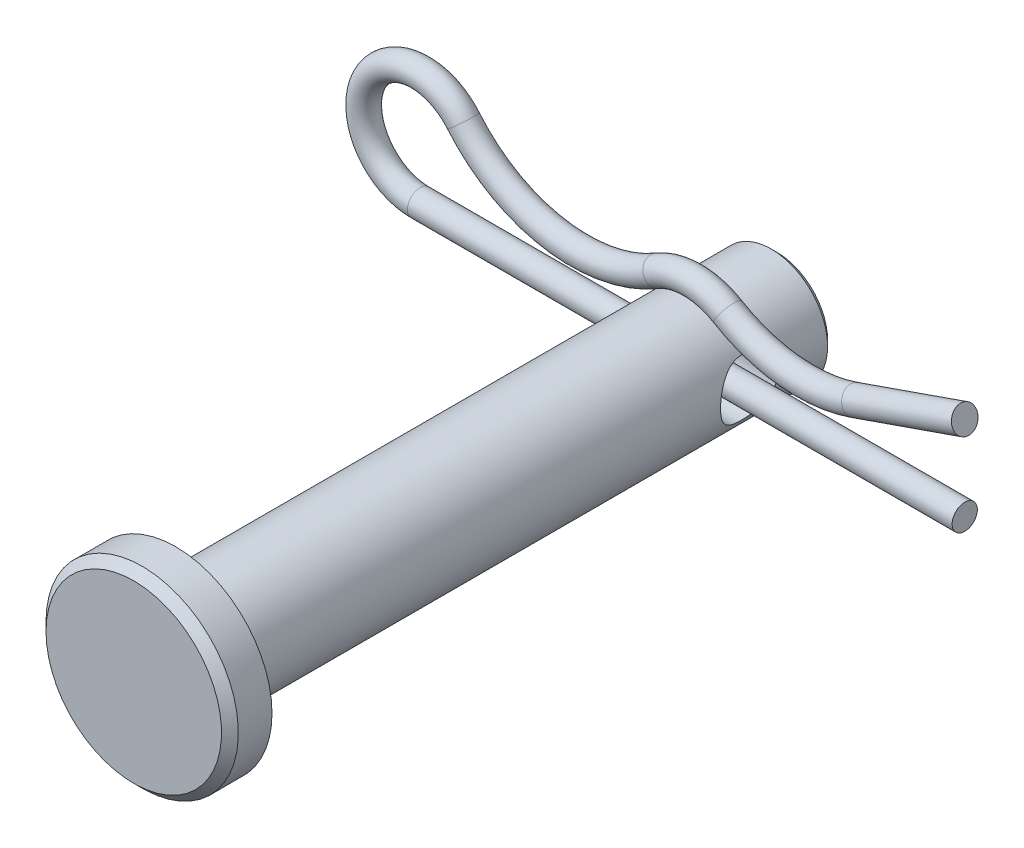
ISO-10303-21;
HEADER;
FILE_DESCRIPTION(('STEP AP214'),'2;1');
FILE_NAME('part.step','',(''),(''),'','','');
FILE_SCHEMA(('AUTOMOTIVE_DESIGN { 1 0 10303 214 1 1 1 1 }'));
ENDSEC;
DATA;
#1=APPLICATION_CONTEXT('core data for automotive mechanical design processes');
#2=APPLICATION_PROTOCOL_DEFINITION('international standard','automotive_design',2000,#1);
#3=PRODUCT_CONTEXT('',#1,'mechanical');
#4=PRODUCT('Part','Part','',(#3));
#5=PRODUCT_RELATED_PRODUCT_CATEGORY('part','',(#4));
#6=PRODUCT_DEFINITION_FORMATION('','',#4);
#7=PRODUCT_DEFINITION_CONTEXT('part definition',#1,'design');
#8=PRODUCT_DEFINITION('design','',#6,#7);
#9=PRODUCT_DEFINITION_SHAPE('','',#8);
#10=(LENGTH_UNIT() NAMED_UNIT(*) SI_UNIT(.MILLI.,.METRE.));
#11=(NAMED_UNIT(*) PLANE_ANGLE_UNIT() SI_UNIT($,.RADIAN.));
#12=(NAMED_UNIT(*) SI_UNIT($,.STERADIAN.) SOLID_ANGLE_UNIT());
#13=UNCERTAINTY_MEASURE_WITH_UNIT(LENGTH_MEASURE(1.E-05),#10,'distance_accuracy_value','');
#14=(GEOMETRIC_REPRESENTATION_CONTEXT(3) GLOBAL_UNCERTAINTY_ASSIGNED_CONTEXT((#13)) GLOBAL_UNIT_ASSIGNED_CONTEXT((#10,
#11,#12)) REPRESENTATION_CONTEXT('',''));
#15=CARTESIAN_POINT('',(0.,0.,0.));
#16=DIRECTION('',(0.,0.,1.));
#17=DIRECTION('',(1.,0.,0.));
#18=AXIS2_PLACEMENT_3D('',#15,#16,#17);
#19=CARTESIAN_POINT('',(6.8677417632059,1.95548396251024,-9.128125));
#20=DIRECTION('',(0.944376159944791,0.32886725061631,0.));
#21=DIRECTION('',(-0.32886725061631,0.944376159944791,0.));
#22=AXIS2_PLACEMENT_3D('',#19,#20,#21);
#23=CYLINDRICAL_SURFACE('',#22,0.533400000000001);
#24=CARTESIAN_POINT('',(6.8677417632059,1.95548396251024,-9.128125));
#25=DIRECTION('',(0.944376159944795,0.328867250616297,0.));
#26=DIRECTION('',(-0.328867250616297,0.944376159944795,0.));
#27=AXIS2_PLACEMENT_3D('',#24,#25,#26);
#28=CIRCLE('',#27,0.533400000000001);
#29=CARTESIAN_POINT('',(7.04315955468464,1.45175371879569,-9.128125));
#30=VERTEX_POINT('',#29);
#31=EDGE_CURVE('E47',#30,#30,#28,.T.);
#32=ORIENTED_EDGE('',*,*,#31,.T.);
#33=EDGE_LOOP('',(#32));
#34=FACE_BOUND('',#33,.T.);
#35=CARTESIAN_POINT('',(11.509375,3.57187500000001,-9.128125));
#36=DIRECTION('',(0.944376159944795,0.328867250616297,0.));
#37=DIRECTION('',(-0.328867250616297,0.944376159944795,0.));
#38=AXIS2_PLACEMENT_3D('',#35,#36,#37);
#39=CIRCLE('',#38,0.533400000000001);
#40=CARTESIAN_POINT('',(11.3339572085213,4.07560524371457,-9.128125));
#41=VERTEX_POINT('',#40);
#42=EDGE_CURVE('E11',#41,#41,#39,.T.);
#43=ORIENTED_EDGE('',*,*,#42,.F.);
#44=EDGE_LOOP('',(#43));
#45=FACE_BOUND('',#44,.T.);
#46=ADVANCED_FACE('F41',(#34,#45),#23,.T.);
#47=CARTESIAN_POINT('',(4.7671809277289,7.98746060907687,-9.128125));
#48=DIRECTION('',(0.,0.,1.));
#49=DIRECTION('',(1.,0.,0.));
#50=AXIS2_PLACEMENT_3D('',#47,#48,#49);
#51=TOROIDAL_SURFACE('',#50,6.38726060907687,0.533400000000001);
#52=CARTESIAN_POINT('',(1.49374300344779,2.50278174480932,-9.128125));
#53=DIRECTION('',(0.858690321242454,-0.5124948118806,0.));
#54=DIRECTION('',(0.5124948118806,0.858690321242454,0.));
#55=AXIS2_PLACEMENT_3D('',#52,#53,#54);
#56=CIRCLE('',#55,0.533400000000001);
#57=CARTESIAN_POINT('',(1.22037827079068,2.04475632745859,-9.128125));
#58=VERTEX_POINT('',#57);
#59=EDGE_CURVE('E51',#58,#58,#56,.T.);
#60=CARTESIAN_POINT('',(4.7671809277289,7.98746060907687,-9.128125));
#61=DIRECTION('',(0.,0.,1.));
#62=DIRECTION('',(1.,0.,0.));
#63=AXIS2_PLACEMENT_3D('',#60,#61,#62);
#64=CIRCLE('',#63,6.92066060907687);
#65=EDGE_CURVE('',#58,#30,#64,.T.);
#66=ORIENTED_EDGE('',*,*,#59,.T.);
#67=ORIENTED_EDGE('',*,*,#31,.F.);
#68=ORIENTED_EDGE('',*,*,#65,.T.);
#69=ORIENTED_EDGE('',*,*,#65,.F.);
#70=EDGE_LOOP('',(#66,#68,#67,#69));
#71=FACE_BOUND('',#70,.T.);
#72=ADVANCED_FACE('F88',(#71),#51,.T.);
#73=CARTESIAN_POINT('',(0.,0.,-9.128125));
#74=DIRECTION('',(0.,0.,-1.));
#75=DIRECTION('',(-1.,0.,0.));
#76=AXIS2_PLACEMENT_3D('',#73,#74,#75);
#77=TOROIDAL_SURFACE('',#76,2.91465,0.533400000000001);
#78=CARTESIAN_POINT('',(-1.49374300344773,2.50278174480936,-9.128125));
#79=DIRECTION('',(0.858690321242467,0.512494811880577,0.));
#80=DIRECTION('',(-0.512494811880577,0.858690321242467,0.));
#81=AXIS2_PLACEMENT_3D('',#78,#79,#80);
#82=CIRCLE('',#81,0.533400000000001);
#83=CARTESIAN_POINT('',(-1.22037827079062,2.04475632745863,-9.128125));
#84=VERTEX_POINT('',#83);
#85=EDGE_CURVE('E55',#84,#84,#82,.T.);
#86=ORIENTED_EDGE('',*,*,#85,.T.);
#87=EDGE_LOOP('',(#86));
#88=FACE_BOUND('',#87,.T.);
#89=ORIENTED_EDGE('',*,*,#59,.F.);
#90=EDGE_LOOP('',(#89));
#91=FACE_BOUND('',#90,.T.);
#92=ADVANCED_FACE('F92',(#88,#91),#77,.T.);
#93=CARTESIAN_POINT('',(-4.7671809277289,7.98746060907687,-9.128125));
#94=DIRECTION('',(0.,0.,1.));
#95=DIRECTION('',(1.,0.,0.));
#96=AXIS2_PLACEMENT_3D('',#93,#94,#95);
#97=TOROIDAL_SURFACE('',#96,6.38726060907687,0.533400000000001);
#98=CARTESIAN_POINT('',(-9.67840844816891,3.90371939167124,-9.128125));
#99=DIRECTION('',(0.639357224848815,-0.7689098380393,0.));
#100=DIRECTION('',(0.7689098380393,0.639357224848815,0.));
#101=AXIS2_PLACEMENT_3D('',#98,#99,#100);
#102=CIRCLE('',#101,0.533400000000001);
#103=CARTESIAN_POINT('',(-10.0885449557791,3.56268624793687,-9.128125));
#104=VERTEX_POINT('',#103);
#105=EDGE_CURVE('E60',#104,#104,#102,.T.);
#106=CARTESIAN_POINT('',(-4.7671809277289,7.98746060907687,-9.128125));
#107=DIRECTION('',(0.,0.,1.));
#108=DIRECTION('',(1.,0.,0.));
#109=AXIS2_PLACEMENT_3D('',#106,#107,#108);
#110=CIRCLE('',#109,6.92066060907687);
#111=EDGE_CURVE('',#104,#84,#110,.T.);
#112=ORIENTED_EDGE('',*,*,#105,.T.);
#113=ORIENTED_EDGE('',*,*,#85,.F.);
#114=ORIENTED_EDGE('',*,*,#111,.T.);
#115=ORIENTED_EDGE('',*,*,#111,.F.);
#116=EDGE_LOOP('',(#112,#114,#113,#115));
#117=FACE_BOUND('',#116,.T.);
#118=ADVANCED_FACE('F98',(#117),#97,.T.);
#119=CARTESIAN_POINT('',(-11.509375,2.38125,-9.128125));
#120=DIRECTION('',(0.,0.,-1.));
#121=DIRECTION('',(-1.,0.,0.));
#122=AXIS2_PLACEMENT_3D('',#119,#120,#121);
#123=TOROIDAL_SURFACE('',#122,2.38125,0.533400000000001);
#124=CARTESIAN_POINT('',(-11.509375,0.,-9.128125));
#125=DIRECTION('',(-1.,0.,0.));
#126=DIRECTION('',(0.,-1.,0.));
#127=AXIS2_PLACEMENT_3D('',#124,#125,#126);
#128=CIRCLE('',#127,0.533400000000001);
#129=CARTESIAN_POINT('',(-11.509375,-0.533400000000001,-9.128125));
#130=VERTEX_POINT('',#129);
#131=EDGE_CURVE('E63',#130,#130,#128,.T.);
#132=ORIENTED_EDGE('',*,*,#131,.T.);
#133=EDGE_LOOP('',(#132));
#134=FACE_BOUND('',#133,.T.);
#135=ORIENTED_EDGE('',*,*,#105,.F.);
#136=EDGE_LOOP('',(#135));
#137=FACE_BOUND('',#136,.T.);
#138=ADVANCED_FACE('F70',(#134,#137),#123,.T.);
#139=CARTESIAN_POINT('',(-11.509375,0.,-9.128125));
#140=DIRECTION('',(1.,0.,0.));
#141=DIRECTION('',(0.,0.,-1.));
#142=AXIS2_PLACEMENT_3D('',#139,#140,#141);
#143=CYLINDRICAL_SURFACE('',#142,0.533400000000001);
#144=ORIENTED_EDGE('',*,*,#131,.F.);
#145=EDGE_LOOP('',(#144));
#146=FACE_BOUND('',#145,.T.);
#147=CARTESIAN_POINT('',(11.509375,0.,-9.128125));
#148=DIRECTION('',(-1.,0.,0.));
#149=DIRECTION('',(0.,-1.,0.));
#150=AXIS2_PLACEMENT_3D('',#147,#148,#149);
#151=CIRCLE('',#150,0.533400000000001);
#152=CARTESIAN_POINT('',(11.509375,-0.533400000000001,-9.128125));
#153=VERTEX_POINT('',#152);
#154=EDGE_CURVE('E64',#153,#153,#151,.T.);
#155=ORIENTED_EDGE('',*,*,#154,.T.);
#156=EDGE_LOOP('',(#155));
#157=FACE_BOUND('',#156,.T.);
#158=ADVANCED_FACE('F73',(#146,#157),#143,.T.);
#159=CARTESIAN_POINT('',(11.509375,3.57187500000001,-9.128125));
#160=DIRECTION('',(0.944376159944795,0.328867250616297,0.));
#161=DIRECTION('',(-0.328867250616297,0.944376159944795,0.));
#162=AXIS2_PLACEMENT_3D('',#159,#160,#161);
#163=PLANE('',#162);
#164=ORIENTED_EDGE('',*,*,#42,.T.);
#165=EDGE_LOOP('',(#164));
#166=FACE_BOUND('',#165,.T.);
#167=ADVANCED_FACE('F76',(#166),#163,.T.);
#168=CARTESIAN_POINT('',(11.509375,0.,-9.128125));
#169=DIRECTION('',(-1.,0.,0.));
#170=DIRECTION('',(0.,-1.,0.));
#171=AXIS2_PLACEMENT_3D('',#168,#169,#170);
#172=PLANE('',#171);
#173=ORIENTED_EDGE('',*,*,#154,.F.);
#174=EDGE_LOOP('',(#173));
#175=FACE_BOUND('',#174,.T.);
#176=ADVANCED_FACE('F80',(#175),#172,.F.);
#177=CLOSED_SHELL('',(#46,#72,#92,#118,#138,#158,#167,#176));
#178=MANIFOLD_SOLID_BREP('B2',#177);
#179=CARTESIAN_POINT('',(0.,0.,12.7));
#180=DIRECTION('',(0.,0.,-1.));
#181=DIRECTION('',(-1.,0.,0.));
#182=AXIS2_PLACEMENT_3D('',#179,#180,#181);
#183=CYLINDRICAL_SURFACE('',#182,2.38125);
#184=CARTESIAN_POINT('',(0.,0.,-12.461875));
#185=DIRECTION('',(0.,0.,1.));
#186=DIRECTION('',(1.,0.,0.));
#187=AXIS2_PLACEMENT_3D('',#184,#185,#186);
#188=CIRCLE('',#187,2.38125);
#189=CARTESIAN_POINT('',(2.38125,0.,-12.461875));
#190=VERTEX_POINT('',#189);
#191=EDGE_CURVE('E164',#190,#190,#188,.T.);
#192=ORIENTED_EDGE('',*,*,#191,.T.);
#193=EDGE_LOOP('',(#192));
#194=FACE_BOUND('',#193,.T.);
#195=CARTESIAN_POINT('',(-2.38125,0.,-7.9375));
#196=CARTESIAN_POINT('',(-2.38124658771817,-0.0625934933908995,-7.93750393182415));
#197=CARTESIAN_POINT('',(-2.37875553370113,-0.12526160776547,-7.94246499331049));
#198=CARTESIAN_POINT('',(-2.36903604532025,-0.248745655116469,-7.9620898356559));
#199=CARTESIAN_POINT('',(-2.36179861446384,-0.309557840743265,-7.97677204291283));
#200=CARTESIAN_POINT('',(-2.34334382664568,-0.427355251873434,-8.01512137838437));
#201=CARTESIAN_POINT('',(-2.33214194770735,-0.484354349749462,-8.03875358874529));
#202=CARTESIAN_POINT('',(-2.30678565164099,-0.593493959385317,-8.09415127106263));
#203=CARTESIAN_POINT('',(-2.29263146732422,-0.645634853781903,-8.12591610174629));
#204=CARTESIAN_POINT('',(-2.26166669988499,-0.747126495522785,-8.19886272516843));
#205=CARTESIAN_POINT('',(-2.24474721461222,-0.796117610742265,-8.2404979643447));
#206=CARTESIAN_POINT('',(-2.2105140207503,-0.886753026544746,-8.3310271362285));
#207=CARTESIAN_POINT('',(-2.19320002298882,-0.928391728636494,-8.37992654851656));
#208=CARTESIAN_POINT('',(-2.15859063769341,-1.00637816303611,-8.48814423802628));
#209=CARTESIAN_POINT('',(-2.14140081986313,-1.04206516514117,-8.5479764170931));
#210=CARTESIAN_POINT('',(-2.11081118475794,-1.10271904514174,-8.67374360940859));
#211=CARTESIAN_POINT('',(-2.09740866244572,-1.12769358094429,-8.73967422201052));
#212=CARTESIAN_POINT('',(-2.07713897941891,-1.16458893898079,-8.87174189114298));
#213=CARTESIAN_POINT('',(-2.06992860854359,-1.1772017235864,-8.93763030074274));
#214=CARTESIAN_POINT('',(-2.06194687719966,-1.19113338890835,-9.07094980373119));
#215=CARTESIAN_POINT('',(-2.06116915374352,-1.19246343021919,-9.13837930647472));
#216=CARTESIAN_POINT('',(-2.06586451337536,-1.18429955128951,-9.26419679770049));
#217=CARTESIAN_POINT('',(-2.07060121735085,-1.17608099119853,-9.32270173717495));
#218=CARTESIAN_POINT('',(-2.0845013483624,-1.15126275778341,-9.43735639834728));
#219=CARTESIAN_POINT('',(-2.09366618546584,-1.13466041470314,-9.49350536362914));
#220=CARTESIAN_POINT('',(-2.1155915160392,-1.09324351977209,-9.60345718596099));
#221=CARTESIAN_POINT('',(-2.12843079040573,-1.06824668928498,-9.65717493105433));
#222=CARTESIAN_POINT('',(-2.15626240722546,-1.01089025937972,-9.75991145461498));
#223=CARTESIAN_POINT('',(-2.17125571566414,-0.97852735278922,-9.80892810832386));
#224=CARTESIAN_POINT('',(-2.204003536286,-0.90257239663054,-9.9074143665474));
#225=CARTESIAN_POINT('',(-2.22186710625626,-0.858076839495927,-9.95615334010161));
#226=CARTESIAN_POINT('',(-2.25680138992047,-0.761470860938948,-10.0457818577598));
#227=CARTESIAN_POINT('',(-2.27387172175947,-0.709356821108759,-10.0866676505153));
#228=CARTESIAN_POINT('',(-2.30626428608779,-0.595927464756045,-10.1612132401635));
#229=CARTESIAN_POINT('',(-2.3214685301789,-0.534297244998046,-10.1944493125057));
#230=CARTESIAN_POINT('',(-2.34741102209979,-0.405367587816348,-10.2498092752043));
#231=CARTESIAN_POINT('',(-2.35815281492167,-0.338072701740844,-10.2719419890337));
#232=CARTESIAN_POINT('',(-2.37320534860897,-0.205700104133523,-10.3026472775502));
#233=CARTESIAN_POINT('',(-2.37797504664999,-0.140900384809099,-10.312191127561));
#234=CARTESIAN_POINT('',(-2.38211931649743,-0.0104532111896992,-10.320493945507));
#235=CARTESIAN_POINT('',(-2.38149644415062,0.0551938267826013,-10.3192580225895));
#236=CARTESIAN_POINT('',(-2.37519200776753,0.180061757270823,-10.3065976616014));
#237=CARTESIAN_POINT('',(-2.36990626897501,0.239386357709477,-10.2959703282183));
#238=CARTESIAN_POINT('',(-2.35532022721706,0.35529070614697,-10.2660790456499));
#239=CARTESIAN_POINT('',(-2.34601948166815,0.411870150775843,-10.2468141443165));
#240=CARTESIAN_POINT('',(-2.323912493394,0.522551749435383,-10.199689325903));
#241=CARTESIAN_POINT('',(-2.31101362357334,0.576536816435452,-10.1715994059547));
#242=CARTESIAN_POINT('',(-2.28295169421308,0.679205558772778,-10.1078813403714));
#243=CARTESIAN_POINT('',(-2.26778767095513,0.727886962326195,-10.0722499834997));
#244=CARTESIAN_POINT('',(-2.23490101029919,0.823635905061684,-9.99042274358805));
#245=CARTESIAN_POINT('',(-2.21707334772675,0.870075505159961,-9.94353302224748));
#246=CARTESIAN_POINT('',(-2.18196785003363,0.954710182325452,-9.84258911676999));
#247=CARTESIAN_POINT('',(-2.1646904022613,0.992899556088159,-9.78853001790926));
#248=CARTESIAN_POINT('',(-2.13182825744162,1.06168973569882,-9.67147427421776));
#249=CARTESIAN_POINT('',(-2.11636605630571,1.0918334810305,-9.60817158617039));
#250=CARTESIAN_POINT('',(-2.090428799133,1.14071736472268,-9.47637082565359));
#251=CARTESIAN_POINT('',(-2.07994732092736,1.15947219672864,-9.40787957625952));
#252=CARTESIAN_POINT('',(-2.06646662138444,1.18331657161977,-9.27467876590559));
#253=CARTESIAN_POINT('',(-2.06284572182647,1.18954509883978,-9.21023734201106));
#254=CARTESIAN_POINT('',(-2.06175000375602,1.19144552443463,-9.08115833564985));
#255=CARTESIAN_POINT('',(-2.06427252119055,1.18712199863718,-9.01652085034461));
#256=CARTESIAN_POINT('',(-2.07451954503311,1.16910579328329,-8.89537745598845));
#257=CARTESIAN_POINT('',(-2.081725593681,1.1563448992644,-8.83868350273432));
#258=CARTESIAN_POINT('',(-2.09991741148739,1.12296816088622,-8.72830345780996));
#259=CARTESIAN_POINT('',(-2.11090439637645,1.10234978978715,-8.67461834007175));
#260=CARTESIAN_POINT('',(-2.13632093965266,1.05229312174863,-8.56778728679407));
#261=CARTESIAN_POINT('',(-2.15093219477964,1.02235532346272,-8.51491990438401));
#262=CARTESIAN_POINT('',(-2.18164566727434,0.955061000604868,-8.41461375535999));
#263=CARTESIAN_POINT('',(-2.19774865799103,0.917700616381016,-8.36717783335142));
#264=CARTESIAN_POINT('',(-2.23197328511557,0.831298335810089,-8.27308720225546));
#265=CARTESIAN_POINT('',(-2.25010245755217,0.781388641146486,-8.22722775625034));
#266=CARTESIAN_POINT('',(-2.28454448778714,0.674078066156022,-8.14435563536124));
#267=CARTESIAN_POINT('',(-2.30085636405197,0.616673173627612,-8.10734772899557));
#268=CARTESIAN_POINT('',(-2.33002942662263,0.49521855746375,-8.04318420558625));
#269=CARTESIAN_POINT('',(-2.34286539970213,0.431124721872151,-8.01610009829451));
#270=CARTESIAN_POINT('',(-2.36340659560876,0.298539814353397,-7.9734471500715));
#271=CARTESIAN_POINT('',(-2.37112639390897,0.230061848926332,-7.95784558236853));
#272=CARTESIAN_POINT('',(-2.37762409336193,0.134066692531779,-7.94476589493782));
#273=CARTESIAN_POINT('',(-2.37898025606987,0.107348987707653,-7.94204504322175));
#274=CARTESIAN_POINT('',(-2.3807939546427,0.0537587806828973,-7.93841122636905));
#275=CARTESIAN_POINT('',(-2.38125146570418,0.0268862742301636,-7.93749831113273));
#276=CARTESIAN_POINT('',(-2.38125,0.,-7.9375));
#277=B_SPLINE_CURVE_WITH_KNOTS('',3,(#195,#196,#197,#198,#199,#200,#201,#202,#203,#204,#205,
#206,#207,#208,#209,#210,#211,#212,#213,#214,#215,#216,#217,#218,#219,#220,#221,#222,#223,#224,
#225,#226,#227,#228,#229,#230,#231,#232,#233,#234,#235,#236,#237,#238,#239,#240,#241,#242,#243,
#244,#245,#246,#247,#248,#249,#250,#251,#252,#253,#254,#255,#256,#257,#258,#259,#260,#261,#262,
#263,#264,#265,#266,#267,#268,#269,#270,#271,#272,#273,#274,#275,#276),.UNSPECIFIED.,.T.,.F.,(4,
2,2,2,2,2,2,2,2,2,2,2,2,2,2,2,2,2,2,2,2,2,2,2,2,2,2,2,2,2,2,2,2,2,2,2,2,2,2,2,4),(0.,
0.187671381491036,0.375699515747514,0.563001503883018,0.750288727442429,0.948906406473725,
1.14767467670684,1.36185743031615,1.57588681716391,1.77710320704461,1.97812053569865,
2.15509926337347,2.33213438424011,2.51329317200605,2.69453345625452,2.89875445775649,
3.10307277131561,3.31687910824069,3.53051527011183,3.72645730217446,3.92230647121476,
4.10297598058852,4.28366541066828,4.46952119208217,4.65545627297242,4.85965036423511,
5.06398516445249,5.27821543446362,5.49216872029489,5.68558331740251,5.87891405645819,
6.0538272319698,6.22879670208067,6.41552156348466,6.60234377481072,6.81186617152194,
7.02150118957732,7.23261841267421,7.44313156831558,7.52374130413947,7.6043532648174),.UNSPECIFIED.);
#278=CARTESIAN_POINT('',(-2.38125,0.,-7.9375));
#279=VERTEX_POINT('',#278);
#280=EDGE_CURVE('E175',#279,#279,#277,.T.);
#281=ORIENTED_EDGE('',*,*,#280,.T.);
#282=EDGE_LOOP('',(#281));
#283=FACE_BOUND('',#282,.T.);
#284=CARTESIAN_POINT('',(2.38125,0.,-10.31875));
#285=CARTESIAN_POINT('',(2.38124658771817,-0.0625934933908995,-10.3187460681758));
#286=CARTESIAN_POINT('',(2.37875553370113,-0.12526160776547,-10.3137850066895));
#287=CARTESIAN_POINT('',(2.36903604532025,-0.248745655116469,-10.2941601643441));
#288=CARTESIAN_POINT('',(2.36179861446384,-0.309557840743266,-10.2794779570872));
#289=CARTESIAN_POINT('',(2.34334382664568,-0.427355251873434,-10.2411286216156));
#290=CARTESIAN_POINT('',(2.33214194770735,-0.48435434974946,-10.2174964112547));
#291=CARTESIAN_POINT('',(2.30678565164099,-0.593493959385315,-10.1620987289374));
#292=CARTESIAN_POINT('',(2.29263146732422,-0.645634853781903,-10.1303338982537));
#293=CARTESIAN_POINT('',(2.26166669988499,-0.747126495522785,-10.0573872748316));
#294=CARTESIAN_POINT('',(2.24474721461222,-0.796117610742265,-10.0157520356553));
#295=CARTESIAN_POINT('',(2.2105140207503,-0.886753026544746,-9.9252228637715));
#296=CARTESIAN_POINT('',(2.19320002298882,-0.928391728636495,-9.87632345148344));
#297=CARTESIAN_POINT('',(2.15859063769341,-1.00637816303611,-9.76810576197373));
#298=CARTESIAN_POINT('',(2.14140081986313,-1.04206516514117,-9.7082735829069));
#299=CARTESIAN_POINT('',(2.11081118475794,-1.10271904514174,-9.58250639059141));
#300=CARTESIAN_POINT('',(2.09740866244572,-1.12769358094429,-9.51657577798948));
#301=CARTESIAN_POINT('',(2.07713897941891,-1.16458893898079,-9.38450810885702));
#302=CARTESIAN_POINT('',(2.06992860854359,-1.1772017235864,-9.31861969925726));
#303=CARTESIAN_POINT('',(2.06194687719966,-1.19113338890835,-9.18530019626881));
#304=CARTESIAN_POINT('',(2.06116915374352,-1.19246343021919,-9.11787069352528));
#305=CARTESIAN_POINT('',(2.06586451337536,-1.18429955128951,-8.99205320229952));
#306=CARTESIAN_POINT('',(2.07060121735085,-1.17608099119853,-8.93354826282506));
#307=CARTESIAN_POINT('',(2.0845013483624,-1.15126275778341,-8.81889360165272));
#308=CARTESIAN_POINT('',(2.09366618546584,-1.13466041470314,-8.76274463637086));
#309=CARTESIAN_POINT('',(2.1155915160392,-1.09324351977209,-8.65279281403901));
#310=CARTESIAN_POINT('',(2.12843079040573,-1.06824668928498,-8.59907506894567));
#311=CARTESIAN_POINT('',(2.15626240722546,-1.01089025937972,-8.49633854538502));
#312=CARTESIAN_POINT('',(2.17125571566414,-0.97852735278922,-8.44732189167615));
#313=CARTESIAN_POINT('',(2.204003536286,-0.90257239663054,-8.3488356334526));
#314=CARTESIAN_POINT('',(2.22186710625626,-0.858076839495927,-8.30009665989839));
#315=CARTESIAN_POINT('',(2.25680138992047,-0.761470860938948,-8.21046814224021));
#316=CARTESIAN_POINT('',(2.27387172175947,-0.709356821108759,-8.16958234948466));
#317=CARTESIAN_POINT('',(2.30626428608779,-0.595927464756045,-8.09503675983648));
#318=CARTESIAN_POINT('',(2.3214685301789,-0.534297244998046,-8.06180068749429));
#319=CARTESIAN_POINT('',(2.34741102209979,-0.405367587816348,-8.00644072479567));
#320=CARTESIAN_POINT('',(2.35815281492167,-0.338072701740844,-7.98430801096632));
#321=CARTESIAN_POINT('',(2.37320534860897,-0.205700104133523,-7.95360272244983));
#322=CARTESIAN_POINT('',(2.37797504664999,-0.140900384809099,-7.94405887243899));
#323=CARTESIAN_POINT('',(2.38211931649743,-0.0104532111896992,-7.935756054493));
#324=CARTESIAN_POINT('',(2.38149644415062,0.0551938267826014,-7.9369919774105));
#325=CARTESIAN_POINT('',(2.37519200776753,0.180061757270823,-7.94965233839858));
#326=CARTESIAN_POINT('',(2.36990626897501,0.239386357709477,-7.96027967178169));
#327=CARTESIAN_POINT('',(2.35532022721706,0.35529070614697,-7.99017095435009));
#328=CARTESIAN_POINT('',(2.34601948166815,0.411870150775843,-8.00943585568353));
#329=CARTESIAN_POINT('',(2.323912493394,0.522551749435382,-8.05656067409699));
#330=CARTESIAN_POINT('',(2.31101362357334,0.576536816435451,-8.08465059404533));
#331=CARTESIAN_POINT('',(2.28295169421308,0.679205558772777,-8.14836865962857));
#332=CARTESIAN_POINT('',(2.26778767095513,0.727886962326195,-8.1840000165003));
#333=CARTESIAN_POINT('',(2.23490101029919,0.823635905061684,-8.26582725641195));
#334=CARTESIAN_POINT('',(2.21707334772675,0.870075505159961,-8.31271697775253));
#335=CARTESIAN_POINT('',(2.18196785003363,0.954710182325452,-8.41366088323002));
#336=CARTESIAN_POINT('',(2.1646904022613,0.992899556088159,-8.46771998209075));
#337=CARTESIAN_POINT('',(2.13182825744162,1.06168973569882,-8.58477572578225));
#338=CARTESIAN_POINT('',(2.11636605630571,1.0918334810305,-8.64807841382961));
#339=CARTESIAN_POINT('',(2.090428799133,1.14071736472268,-8.77987917434641));
#340=CARTESIAN_POINT('',(2.07994732092736,1.15947219672864,-8.84837042374048));
#341=CARTESIAN_POINT('',(2.06646662138444,1.18331657161977,-8.98157123409441));
#342=CARTESIAN_POINT('',(2.06284572182647,1.18954509883978,-9.04601265798895));
#343=CARTESIAN_POINT('',(2.06175000375602,1.19144552443463,-9.17509166435015));
#344=CARTESIAN_POINT('',(2.06427252119055,1.18712199863718,-9.23972914965539));
#345=CARTESIAN_POINT('',(2.07451954503311,1.16910579328329,-9.36087254401156));
#346=CARTESIAN_POINT('',(2.081725593681,1.1563448992644,-9.41756649726568));
#347=CARTESIAN_POINT('',(2.09991741148739,1.12296816088622,-9.52794654219004));
#348=CARTESIAN_POINT('',(2.11090439637645,1.10234978978715,-9.58163165992825));
#349=CARTESIAN_POINT('',(2.13632093965266,1.05229312174863,-9.68846271320593));
#350=CARTESIAN_POINT('',(2.15093219477964,1.02235532346272,-9.74133009561599));
#351=CARTESIAN_POINT('',(2.18164566727434,0.955061000604869,-9.84163624464001));
#352=CARTESIAN_POINT('',(2.19774865799103,0.917700616381016,-9.88907216664858));
#353=CARTESIAN_POINT('',(2.23197328511557,0.831298335810089,-9.98316279774454));
#354=CARTESIAN_POINT('',(2.25010245755217,0.781388641146486,-10.0290222437497));
#355=CARTESIAN_POINT('',(2.28454448778714,0.674078066156021,-10.1118943646388));
#356=CARTESIAN_POINT('',(2.30085636405197,0.616673173627611,-10.1489022710044));
#357=CARTESIAN_POINT('',(2.33002942662263,0.49521855746375,-10.2130657944138));
#358=CARTESIAN_POINT('',(2.34286539970213,0.431124721872151,-10.2401499017055));
#359=CARTESIAN_POINT('',(2.36340659560876,0.298539814353397,-10.2828028499285));
#360=CARTESIAN_POINT('',(2.37112639390897,0.230061848926332,-10.2984044176315));
#361=CARTESIAN_POINT('',(2.37762409336193,0.134066692531779,-10.3114841050622));
#362=CARTESIAN_POINT('',(2.37898025606987,0.107348987707653,-10.3142049567782));
#363=CARTESIAN_POINT('',(2.3807939546427,0.0537587806828973,-10.3178387736309));
#364=CARTESIAN_POINT('',(2.38125146570418,0.0268862742301636,-10.3187516888673));
#365=CARTESIAN_POINT('',(2.38125,0.,-10.31875));
#366=B_SPLINE_CURVE_WITH_KNOTS('',3,(#284,#285,#286,#287,#288,#289,#290,#291,#292,#293,#294,
#295,#296,#297,#298,#299,#300,#301,#302,#303,#304,#305,#306,#307,#308,#309,#310,#311,#312,#313,
#314,#315,#316,#317,#318,#319,#320,#321,#322,#323,#324,#325,#326,#327,#328,#329,#330,#331,#332,
#333,#334,#335,#336,#337,#338,#339,#340,#341,#342,#343,#344,#345,#346,#347,#348,#349,#350,#351,
#352,#353,#354,#355,#356,#357,#358,#359,#360,#361,#362,#363,#364,#365),.UNSPECIFIED.,.T.,.F.,(4,
2,2,2,2,2,2,2,2,2,2,2,2,2,2,2,2,2,2,2,2,2,2,2,2,2,2,2,2,2,2,2,2,2,2,2,2,2,2,2,4),(0.,
0.187671381491036,0.375699515747514,0.563001503883016,0.750288727442429,0.948906406473725,
1.14767467670684,1.36185743031615,1.57588681716391,1.77710320704461,1.97812053569865,
2.15509926337347,2.33213438424011,2.51329317200605,2.69453345625452,2.89875445775649,
3.10307277131561,3.31687910824069,3.53051527011183,3.72645730217446,3.92230647121476,
4.10297598058852,4.28366541066828,4.46952119208217,4.65545627297242,4.85965036423511,
5.06398516445249,5.27821543446362,5.49216872029489,5.68558331740251,5.87891405645819,
6.0538272319698,6.22879670208067,6.41552156348466,6.60234377481072,6.81186617152194,
7.02150118957732,7.23261841267421,7.44313156831558,7.52374130413947,7.6043532648174),.UNSPECIFIED.);
#367=CARTESIAN_POINT('',(2.38125,0.,-10.31875));
#368=VERTEX_POINT('',#367);
#369=EDGE_CURVE('E184',#368,#368,#366,.T.);
#370=ORIENTED_EDGE('',*,*,#369,.T.);
#371=EDGE_LOOP('',(#370));
#372=FACE_BOUND('',#371,.T.);
#373=CARTESIAN_POINT('',(0.,0.,12.7));
#374=DIRECTION('',(0.,0.,1.));
#375=DIRECTION('',(1.,0.,0.));
#376=AXIS2_PLACEMENT_3D('',#373,#374,#375);
#377=CIRCLE('',#376,2.38125);
#378=CARTESIAN_POINT('',(2.38125,0.,12.7));
#379=VERTEX_POINT('',#378);
#380=EDGE_CURVE('E223',#379,#379,#377,.T.);
#381=ORIENTED_EDGE('',*,*,#380,.F.);
#382=EDGE_LOOP('',(#381));
#383=FACE_BOUND('',#382,.T.);
#384=ADVANCED_FACE('F157',(#194,#283,#372,#383),#183,.T.);
#385=CARTESIAN_POINT('',(0.,0.,-12.7));
#386=DIRECTION('',(0.,0.,1.));
#387=DIRECTION('',(1.,0.,0.));
#388=AXIS2_PLACEMENT_3D('',#385,#386,#387);
#389=PLANE('',#388);
#390=CARTESIAN_POINT('',(0.,0.,-12.7));
#391=DIRECTION('',(0.,0.,1.));
#392=DIRECTION('',(1.,0.,0.));
#393=AXIS2_PLACEMENT_3D('',#390,#391,#392);
#394=CIRCLE('',#393,2.14312500000001);
#395=CARTESIAN_POINT('',(2.14312500000001,0.,-12.7));
#396=VERTEX_POINT('',#395);
#397=EDGE_CURVE('E40',#396,#396,#394,.F.);
#398=ORIENTED_EDGE('',*,*,#397,.T.);
#399=EDGE_LOOP('',(#398));
#400=FACE_BOUND('',#399,.T.);
#401=ADVANCED_FACE('F205',(#400),#389,.F.);
#402=CARTESIAN_POINT('',(0.,0.,12.7));
#403=DIRECTION('',(0.,0.,1.));
#404=DIRECTION('',(1.,0.,0.));
#405=AXIS2_PLACEMENT_3D('',#402,#403,#404);
#406=PLANE('',#405);
#407=CARTESIAN_POINT('',(0.,0.,12.7));
#408=DIRECTION('',(0.,0.,1.));
#409=DIRECTION('',(1.,0.,0.));
#410=AXIS2_PLACEMENT_3D('',#407,#408,#409);
#411=CIRCLE('',#410,4.064);
#412=CARTESIAN_POINT('',(4.064,0.,12.7));
#413=VERTEX_POINT('',#412);
#414=EDGE_CURVE('E183',#413,#413,#411,.T.);
#415=ORIENTED_EDGE('',*,*,#414,.F.);
#416=EDGE_LOOP('',(#415));
#417=FACE_BOUND('',#416,.T.);
#418=ORIENTED_EDGE('',*,*,#380,.T.);
#419=EDGE_LOOP('',(#418));
#420=FACE_BOUND('',#419,.T.);
#421=ADVANCED_FACE('F202',(#417,#420),#406,.F.);
#422=CARTESIAN_POINT('',(0.,0.,14.478));
#423=DIRECTION('',(0.,0.,-1.));
#424=DIRECTION('',(-1.,0.,0.));
#425=AXIS2_PLACEMENT_3D('',#422,#423,#424);
#426=CYLINDRICAL_SURFACE('',#425,4.064);
#427=CARTESIAN_POINT('',(0.,0.,14.1224));
#428=DIRECTION('',(0.,0.,1.));
#429=DIRECTION('',(1.,0.,0.));
#430=AXIS2_PLACEMENT_3D('',#427,#428,#429);
#431=CIRCLE('',#430,4.064);
#432=CARTESIAN_POINT('',(-4.064,0.,14.1224));
#433=VERTEX_POINT('',#432);
#434=EDGE_CURVE('E168',#433,#433,#431,.F.);
#435=ORIENTED_EDGE('',*,*,#434,.T.);
#436=EDGE_LOOP('',(#435));
#437=FACE_BOUND('',#436,.T.);
#438=ORIENTED_EDGE('',*,*,#414,.T.);
#439=EDGE_LOOP('',(#438));
#440=FACE_BOUND('',#439,.T.);
#441=ADVANCED_FACE('F200',(#437,#440),#426,.T.);
#442=CARTESIAN_POINT('',(0.,0.,14.478));
#443=DIRECTION('',(0.,0.,1.));
#444=DIRECTION('',(1.,0.,0.));
#445=AXIS2_PLACEMENT_3D('',#442,#443,#444);
#446=PLANE('',#445);
#447=CARTESIAN_POINT('',(0.,0.,14.478));
#448=DIRECTION('',(0.,0.,1.));
#449=DIRECTION('',(1.,0.,0.));
#450=AXIS2_PLACEMENT_3D('',#447,#448,#449);
#451=CIRCLE('',#450,3.7084);
#452=CARTESIAN_POINT('',(-3.7084,0.,14.478));
#453=VERTEX_POINT('',#452);
#454=EDGE_CURVE('E172',#453,#453,#451,.T.);
#455=ORIENTED_EDGE('',*,*,#454,.T.);
#456=EDGE_LOOP('',(#455));
#457=FACE_BOUND('',#456,.T.);
#458=ADVANCED_FACE('F196',(#457),#446,.T.);
#459=CARTESIAN_POINT('',(0.,0.,14.478));
#460=DIRECTION('',(0.,0.,-1.));
#461=DIRECTION('',(-1.,0.,0.));
#462=AXIS2_PLACEMENT_3D('',#459,#460,#461);
#463=CONICAL_SURFACE('',#462,3.7084,0.785398163397446);
#464=CARTESIAN_POINT('',(-4.064,0.,14.1224));
#465=CARTESIAN_POINT('',(-4.06029583333333,0.,14.1261041666667));
#466=CARTESIAN_POINT('',(-4.05659166666667,0.,14.1298083333333));
#467=CARTESIAN_POINT('',(-4.04918333333333,0.,14.1372166666667));
#468=CARTESIAN_POINT('',(-4.04547916666667,0.,14.1409208333333));
#469=CARTESIAN_POINT('',(-4.03807083333333,0.,14.1483291666667));
#470=CARTESIAN_POINT('',(-4.03436666666667,0.,14.1520333333333));
#471=CARTESIAN_POINT('',(-4.02695833333333,0.,14.1594416666667));
#472=CARTESIAN_POINT('',(-4.02325416666667,0.,14.1631458333333));
#473=CARTESIAN_POINT('',(-4.01584583333333,0.,14.1705541666667));
#474=CARTESIAN_POINT('',(-4.01214166666667,0.,14.1742583333333));
#475=CARTESIAN_POINT('',(-4.00473333333333,0.,14.1816666666667));
#476=CARTESIAN_POINT('',(-4.00102916666667,0.,14.1853708333333));
#477=CARTESIAN_POINT('',(-3.99362083333333,0.,14.1927791666667));
#478=CARTESIAN_POINT('',(-3.98991666666667,0.,14.1964833333333));
#479=CARTESIAN_POINT('',(-3.98250833333333,0.,14.2038916666667));
#480=CARTESIAN_POINT('',(-3.97880416666667,0.,14.2075958333333));
#481=CARTESIAN_POINT('',(-3.97139583333333,0.,14.2150041666667));
#482=CARTESIAN_POINT('',(-3.96769166666667,0.,14.2187083333333));
#483=CARTESIAN_POINT('',(-3.96028333333333,0.,14.2261166666667));
#484=CARTESIAN_POINT('',(-3.95657916666667,0.,14.2298208333333));
#485=CARTESIAN_POINT('',(-3.94917083333333,0.,14.2372291666667));
#486=CARTESIAN_POINT('',(-3.94546666666667,0.,14.2409333333333));
#487=CARTESIAN_POINT('',(-3.93805833333333,0.,14.2483416666667));
#488=CARTESIAN_POINT('',(-3.93435416666667,0.,14.2520458333333));
#489=CARTESIAN_POINT('',(-3.92694583333333,0.,14.2594541666667));
#490=CARTESIAN_POINT('',(-3.92324166666667,0.,14.2631583333333));
#491=CARTESIAN_POINT('',(-3.91583333333333,0.,14.2705666666667));
#492=CARTESIAN_POINT('',(-3.91212916666667,0.,14.2742708333333));
#493=CARTESIAN_POINT('',(-3.90472083333333,0.,14.2816791666667));
#494=CARTESIAN_POINT('',(-3.90101666666667,0.,14.2853833333333));
#495=CARTESIAN_POINT('',(-3.89360833333333,0.,14.2927916666667));
#496=CARTESIAN_POINT('',(-3.88990416666667,0.,14.2964958333333));
#497=CARTESIAN_POINT('',(-3.88249583333333,0.,14.3039041666667));
#498=CARTESIAN_POINT('',(-3.87879166666667,0.,14.3076083333333));
#499=CARTESIAN_POINT('',(-3.87138333333333,0.,14.3150166666667));
#500=CARTESIAN_POINT('',(-3.86767916666667,0.,14.3187208333333));
#501=CARTESIAN_POINT('',(-3.86027083333333,0.,14.3261291666667));
#502=CARTESIAN_POINT('',(-3.85656666666667,0.,14.3298333333333));
#503=CARTESIAN_POINT('',(-3.84915833333333,0.,14.3372416666667));
#504=CARTESIAN_POINT('',(-3.84545416666667,0.,14.3409458333333));
#505=CARTESIAN_POINT('',(-3.83804583333333,0.,14.3483541666667));
#506=CARTESIAN_POINT('',(-3.83434166666667,0.,14.3520583333333));
#507=CARTESIAN_POINT('',(-3.82693333333333,0.,14.3594666666667));
#508=CARTESIAN_POINT('',(-3.82322916666667,0.,14.3631708333333));
#509=CARTESIAN_POINT('',(-3.81582083333333,0.,14.3705791666667));
#510=CARTESIAN_POINT('',(-3.81211666666667,0.,14.3742833333333));
#511=CARTESIAN_POINT('',(-3.80470833333333,0.,14.3816916666667));
#512=CARTESIAN_POINT('',(-3.80100416666667,0.,14.3853958333333));
#513=CARTESIAN_POINT('',(-3.79359583333333,0.,14.3928041666667));
#514=CARTESIAN_POINT('',(-3.78989166666667,0.,14.3965083333333));
#515=CARTESIAN_POINT('',(-3.78248333333333,0.,14.4039166666667));
#516=CARTESIAN_POINT('',(-3.77877916666667,0.,14.4076208333333));
#517=CARTESIAN_POINT('',(-3.77137083333333,0.,14.4150291666667));
#518=CARTESIAN_POINT('',(-3.76766666666667,0.,14.4187333333333));
#519=CARTESIAN_POINT('',(-3.76025833333333,0.,14.4261416666667));
#520=CARTESIAN_POINT('',(-3.75655416666667,0.,14.4298458333333));
#521=CARTESIAN_POINT('',(-3.74914583333333,0.,14.4372541666667));
#522=CARTESIAN_POINT('',(-3.74544166666667,0.,14.4409583333333));
#523=CARTESIAN_POINT('',(-3.73803333333333,0.,14.4483666666667));
#524=CARTESIAN_POINT('',(-3.73432916666667,0.,14.4520708333333));
#525=CARTESIAN_POINT('',(-3.72692083333333,0.,14.4594791666667));
#526=CARTESIAN_POINT('',(-3.72321666666666,0.,14.4631833333333));
#527=CARTESIAN_POINT('',(-3.71580833333333,0.,14.4705916666667));
#528=CARTESIAN_POINT('',(-3.71210416666666,0.,14.4742958333333));
#529=CARTESIAN_POINT('',(-3.7084,0.,14.478));
#530=B_SPLINE_CURVE_WITH_KNOTS('',3,(#464,#465,#466,#467,#468,#469,#470,#471,#472,#473,#474,
#475,#476,#477,#478,#479,#480,#481,#482,#483,#484,#485,#486,#487,#488,#489,#490,#491,#492,#493,
#494,#495,#496,#497,#498,#499,#500,#501,#502,#503,#504,#505,#506,#507,#508,#509,#510,#511,#512,
#513,#514,#515,#516,#517,#518,#519,#520,#521,#522,#523,#524,#525,#526,#527,#528,#529),
.UNSPECIFIED.,.F.,.F.,(4,2,2,2,2,2,2,2,2,2,2,2,2,2,2,2,2,2,2,2,2,2,2,2,2,2,2,2,2,2,2,2,4),(0.,
0.0157154482118703,0.0314308964237412,0.0471463446356127,0.0628617928474843,0.0785772410593552,
0.0942926892712267,0.110008137483098,0.125723585694969,0.141439033906839,0.157154482118711,
0.172869930330583,0.188585378542453,0.204300826754325,0.220016274966196,0.235731723178068,
0.251447171389939,0.267162619601809,0.28287806781368,0.298593516025552,0.314308964237423,
0.330024412449294,0.345739860661166,0.361455308873037,0.377170757084908,0.392886205296778,
0.40860165350865,0.424317101720521,0.440032549932392,0.455747998144264,0.471463446356135,
0.487178894568007,0.502894342779878),.UNSPECIFIED.);
#531=EDGE_CURVE('BSEAM194',#433,#453,#530,.T.);
#532=ORIENTED_EDGE('',*,*,#434,.F.);
#533=ORIENTED_EDGE('',*,*,#454,.F.);
#534=ORIENTED_EDGE('',*,*,#531,.T.);
#535=ORIENTED_EDGE('',*,*,#531,.F.);
#536=EDGE_LOOP('',(#532,#534,#533,#535));
#537=FACE_BOUND('',#536,.T.);
#538=ADVANCED_FACE('F194',(#537),#463,.T.);
#539=CARTESIAN_POINT('',(-4.064,0.,-9.128125));
#540=DIRECTION('',(1.,0.,0.));
#541=DIRECTION('',(0.,0.,-1.));
#542=AXIS2_PLACEMENT_3D('',#539,#540,#541);
#543=CYLINDRICAL_SURFACE('',#542,1.190625);
#544=ORIENTED_EDGE('',*,*,#369,.F.);
#545=EDGE_LOOP('',(#544));
#546=FACE_BOUND('',#545,.T.);
#547=ORIENTED_EDGE('',*,*,#280,.F.);
#548=EDGE_LOOP('',(#547));
#549=FACE_BOUND('',#548,.T.);
#550=ADVANCED_FACE('F190',(#546,#549),#543,.F.);
#551=CARTESIAN_POINT('',(0.,0.,-12.461875));
#552=DIRECTION('',(0.,0.,1.));
#553=DIRECTION('',(1.,0.,0.));
#554=AXIS2_PLACEMENT_3D('',#551,#552,#553);
#555=CONICAL_SURFACE('',#554,2.38125,0.785398163397446);
#556=ORIENTED_EDGE('',*,*,#397,.F.);
#557=EDGE_LOOP('',(#556));
#558=FACE_BOUND('',#557,.T.);
#559=ORIENTED_EDGE('',*,*,#191,.F.);
#560=EDGE_LOOP('',(#559));
#561=FACE_BOUND('',#560,.T.);
#562=ADVANCED_FACE('F159',(#558,#561),#555,.T.);
#563=CLOSED_SHELL('',(#384,#401,#421,#441,#458,#538,#550,#562));
#564=MANIFOLD_SOLID_BREP('B6',#563);
#565=ADVANCED_BREP_SHAPE_REPRESENTATION('',(#18,#178,#564),#14);
#566=SHAPE_DEFINITION_REPRESENTATION(#9,#565);
ENDSEC;
END-ISO-10303-21;
